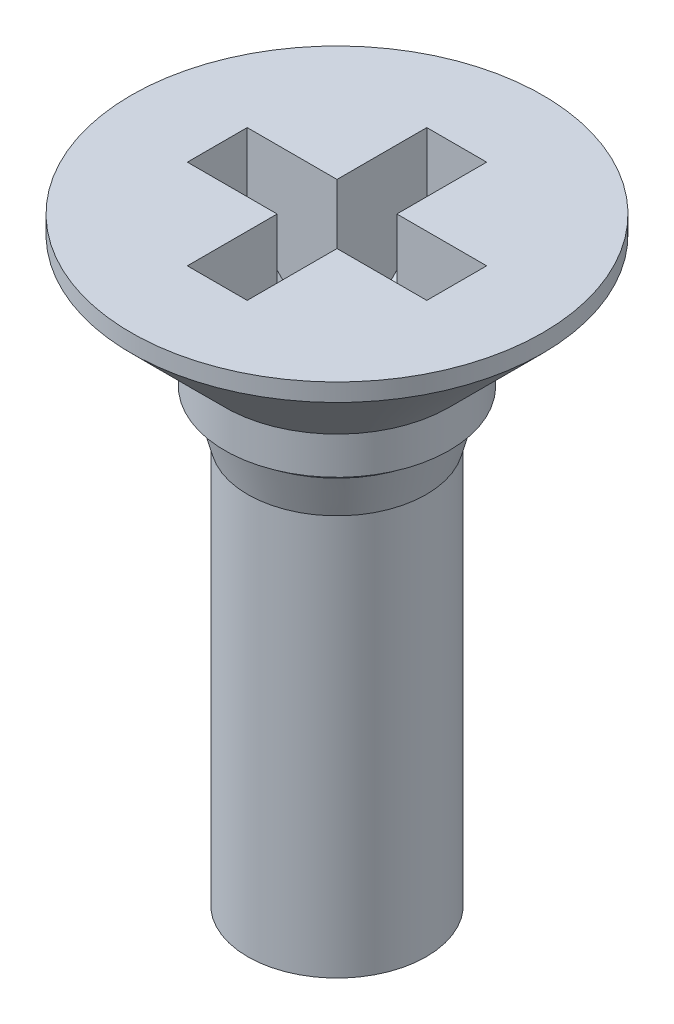
ISO-10303-21;
HEADER;
FILE_DESCRIPTION(('STEP AP214'),'2;1');
FILE_NAME('part.step','',(''),(''),'','','');
FILE_SCHEMA(('AUTOMOTIVE_DESIGN { 1 0 10303 214 1 1 1 1 }'));
ENDSEC;
DATA;
#1=APPLICATION_CONTEXT('core data for automotive mechanical design processes');
#2=APPLICATION_PROTOCOL_DEFINITION('international standard','automotive_design',2000,#1);
#3=PRODUCT_CONTEXT('',#1,'mechanical');
#4=PRODUCT('Part','Part','',(#3));
#5=PRODUCT_RELATED_PRODUCT_CATEGORY('part','',(#4));
#6=PRODUCT_DEFINITION_FORMATION('','',#4);
#7=PRODUCT_DEFINITION_CONTEXT('part definition',#1,'design');
#8=PRODUCT_DEFINITION('design','',#6,#7);
#9=PRODUCT_DEFINITION_SHAPE('','',#8);
#10=(LENGTH_UNIT() NAMED_UNIT(*) SI_UNIT(.MILLI.,.METRE.));
#11=(NAMED_UNIT(*) PLANE_ANGLE_UNIT() SI_UNIT($,.RADIAN.));
#12=(NAMED_UNIT(*) SI_UNIT($,.STERADIAN.) SOLID_ANGLE_UNIT());
#13=UNCERTAINTY_MEASURE_WITH_UNIT(LENGTH_MEASURE(1.E-05),#10,'distance_accuracy_value','');
#14=(GEOMETRIC_REPRESENTATION_CONTEXT(3) GLOBAL_UNCERTAINTY_ASSIGNED_CONTEXT((#13)) GLOBAL_UNIT_ASSIGNED_CONTEXT((#10,
#11,#12)) REPRESENTATION_CONTEXT('',''));
#15=CARTESIAN_POINT('',(0.,0.,0.));
#16=DIRECTION('',(0.,0.,1.));
#17=DIRECTION('',(1.,0.,0.));
#18=AXIS2_PLACEMENT_3D('',#15,#16,#17);
#19=CARTESIAN_POINT('',(0.,-2.65,-0.4));
#20=DIRECTION('',(0.,0.,-1.));
#21=DIRECTION('',(-1.,0.,0.));
#22=AXIS2_PLACEMENT_3D('',#19,#20,#21);
#23=PLANE('',#22);
#24=DIRECTION('',(0.,1.,0.));
#25=VECTOR('',#24,1.);
#26=CARTESIAN_POINT('',(0.4,-2.65,-0.4));
#27=LINE('',#26,#25);
#28=CARTESIAN_POINT('',(0.4,-2.1,-0.4));
#29=VERTEX_POINT('',#28);
#30=CARTESIAN_POINT('',(0.4,0.,-0.4));
#31=VERTEX_POINT('',#30);
#32=EDGE_CURVE('E198',#29,#31,#27,.T.);
#33=ORIENTED_EDGE('',*,*,#32,.F.);
#34=DIRECTION('',(1.,0.,0.));
#35=VECTOR('',#34,1.);
#36=CARTESIAN_POINT('',(-0.550000000000002,-2.1,-0.4));
#37=LINE('',#36,#35);
#38=CARTESIAN_POINT('',(0.550000000000002,-2.1,-0.4));
#39=VERTEX_POINT('',#38);
#40=EDGE_CURVE('E233',#29,#39,#37,.T.);
#41=ORIENTED_EDGE('',*,*,#40,.T.);
#42=DIRECTION('',(0.707106781186546,0.707106781186548,0.));
#43=VECTOR('',#42,1.);
#44=CARTESIAN_POINT('',(1.6,-1.05,-0.4));
#45=LINE('',#44,#43);
#46=CARTESIAN_POINT('',(1.6,-1.05,-0.4));
#47=VERTEX_POINT('',#46);
#48=EDGE_CURVE('E237',#39,#47,#45,.T.);
#49=ORIENTED_EDGE('',*,*,#48,.T.);
#50=DIRECTION('',(0.,1.,0.));
#51=VECTOR('',#50,1.);
#52=CARTESIAN_POINT('',(1.6,0.,-0.4));
#53=LINE('',#52,#51);
#54=CARTESIAN_POINT('',(1.6,0.,-0.4));
#55=VERTEX_POINT('',#54);
#56=EDGE_CURVE('E240',#47,#55,#53,.T.);
#57=ORIENTED_EDGE('',*,*,#56,.T.);
#58=DIRECTION('',(-1.,0.,0.));
#59=VECTOR('',#58,1.);
#60=CARTESIAN_POINT('',(1.6,0.,-0.4));
#61=LINE('',#60,#59);
#62=EDGE_CURVE('E244',#55,#31,#61,.T.);
#63=ORIENTED_EDGE('',*,*,#62,.T.);
#64=EDGE_LOOP('',(#33,#41,#49,#57,#63));
#65=FACE_BOUND('',#64,.T.);
#66=ADVANCED_FACE('F36',(#65),#23,.F.);
#67=CARTESIAN_POINT('',(0.,-2.65,0.4));
#68=DIRECTION('',(0.,0.,-1.));
#69=DIRECTION('',(-1.,0.,0.));
#70=AXIS2_PLACEMENT_3D('',#67,#68,#69);
#71=PLANE('',#70);
#72=DIRECTION('',(1.,0.,0.));
#73=VECTOR('',#72,1.);
#74=CARTESIAN_POINT('',(-0.550000000000002,-2.1,0.4));
#75=LINE('',#74,#73);
#76=CARTESIAN_POINT('',(0.4,-2.1,0.4));
#77=VERTEX_POINT('',#76);
#78=CARTESIAN_POINT('',(0.550000000000002,-2.1,0.4));
#79=VERTEX_POINT('',#78);
#80=EDGE_CURVE('E215',#77,#79,#75,.T.);
#81=ORIENTED_EDGE('',*,*,#80,.F.);
#82=DIRECTION('',(0.,1.,0.));
#83=VECTOR('',#82,1.);
#84=CARTESIAN_POINT('',(0.4,-2.65,0.4));
#85=LINE('',#84,#83);
#86=CARTESIAN_POINT('',(0.4,0.,0.4));
#87=VERTEX_POINT('',#86);
#88=EDGE_CURVE('E44',#77,#87,#85,.T.);
#89=ORIENTED_EDGE('',*,*,#88,.T.);
#90=DIRECTION('',(-1.,0.,0.));
#91=VECTOR('',#90,1.);
#92=CARTESIAN_POINT('',(1.6,0.,0.4));
#93=LINE('',#92,#91);
#94=CARTESIAN_POINT('',(1.6,0.,0.4));
#95=VERTEX_POINT('',#94);
#96=EDGE_CURVE('E224',#95,#87,#93,.T.);
#97=ORIENTED_EDGE('',*,*,#96,.F.);
#98=DIRECTION('',(0.,1.,0.));
#99=VECTOR('',#98,1.);
#100=CARTESIAN_POINT('',(1.6,0.,0.4));
#101=LINE('',#100,#99);
#102=CARTESIAN_POINT('',(1.6,-1.05,0.4));
#103=VERTEX_POINT('',#102);
#104=EDGE_CURVE('E221',#103,#95,#101,.T.);
#105=ORIENTED_EDGE('',*,*,#104,.F.);
#106=DIRECTION('',(0.707106781186546,0.707106781186548,0.));
#107=VECTOR('',#106,1.);
#108=CARTESIAN_POINT('',(1.6,-1.05,0.4));
#109=LINE('',#108,#107);
#110=EDGE_CURVE('E218',#79,#103,#109,.T.);
#111=ORIENTED_EDGE('',*,*,#110,.F.);
#112=EDGE_LOOP('',(#81,#89,#97,#105,#111));
#113=FACE_BOUND('',#112,.T.);
#114=ADVANCED_FACE('F290',(#113),#71,.T.);
#115=CARTESIAN_POINT('',(0.,0.,0.));
#116=DIRECTION('',(0.,-1.,0.));
#117=DIRECTION('',(1.,0.,0.));
#118=AXIS2_PLACEMENT_3D('',#115,#116,#117);
#119=PLANE('',#118);
#120=DIRECTION('',(1.,0.,0.));
#121=VECTOR('',#120,1.);
#122=CARTESIAN_POINT('',(-0.4,0.,1.6));
#123=LINE('',#122,#121);
#124=CARTESIAN_POINT('',(-0.4,0.,1.6));
#125=VERTEX_POINT('',#124);
#126=CARTESIAN_POINT('',(0.4,0.,1.6));
#127=VERTEX_POINT('',#126);
#128=EDGE_CURVE('E199',#125,#127,#123,.T.);
#129=ORIENTED_EDGE('',*,*,#128,.F.);
#130=DIRECTION('',(0.,0.,1.));
#131=VECTOR('',#130,1.);
#132=CARTESIAN_POINT('',(-0.4,0.,-1.6));
#133=LINE('',#132,#131);
#134=CARTESIAN_POINT('',(-0.4,0.,0.399999999999999));
#135=VERTEX_POINT('',#134);
#136=EDGE_CURVE('E192',#135,#125,#133,.T.);
#137=ORIENTED_EDGE('',*,*,#136,.F.);
#138=CARTESIAN_POINT('',(-1.6,0.,0.4));
#139=VERTEX_POINT('',#138);
#140=EDGE_CURVE('E223',#135,#139,#93,.T.);
#141=ORIENTED_EDGE('',*,*,#140,.T.);
#142=DIRECTION('',(0.,0.,1.));
#143=VECTOR('',#142,1.);
#144=CARTESIAN_POINT('',(-1.6,0.,-0.4));
#145=LINE('',#144,#143);
#146=CARTESIAN_POINT('',(-1.6,0.,-0.4));
#147=VERTEX_POINT('',#146);
#148=EDGE_CURVE('E254',#147,#139,#145,.T.);
#149=ORIENTED_EDGE('',*,*,#148,.F.);
#150=CARTESIAN_POINT('',(-0.4,0.,-0.4));
#151=VERTEX_POINT('',#150);
#152=EDGE_CURVE('E243',#151,#147,#61,.T.);
#153=ORIENTED_EDGE('',*,*,#152,.F.);
#154=CARTESIAN_POINT('',(-0.4,0.,-1.6));
#155=VERTEX_POINT('',#154);
#156=EDGE_CURVE('E193',#155,#151,#133,.T.);
#157=ORIENTED_EDGE('',*,*,#156,.F.);
#158=DIRECTION('',(1.,0.,0.));
#159=VECTOR('',#158,1.);
#160=CARTESIAN_POINT('',(-0.4,0.,-1.6));
#161=LINE('',#160,#159);
#162=CARTESIAN_POINT('',(0.4,0.,-1.6));
#163=VERTEX_POINT('',#162);
#164=EDGE_CURVE('E201',#155,#163,#161,.T.);
#165=ORIENTED_EDGE('',*,*,#164,.T.);
#166=DIRECTION('',(0.,0.,1.));
#167=VECTOR('',#166,1.);
#168=CARTESIAN_POINT('',(0.4,0.,-1.6));
#169=LINE('',#168,#167);
#170=EDGE_CURVE('E177',#163,#31,#169,.T.);
#171=ORIENTED_EDGE('',*,*,#170,.T.);
#172=ORIENTED_EDGE('',*,*,#62,.F.);
#173=DIRECTION('',(0.,0.,1.));
#174=VECTOR('',#173,1.);
#175=CARTESIAN_POINT('',(1.6,0.,-0.4));
#176=LINE('',#175,#174);
#177=EDGE_CURVE('E257',#55,#95,#176,.T.);
#178=ORIENTED_EDGE('',*,*,#177,.T.);
#179=ORIENTED_EDGE('',*,*,#96,.T.);
#180=EDGE_CURVE('E59',#87,#127,#169,.T.);
#181=ORIENTED_EDGE('',*,*,#180,.T.);
#182=EDGE_LOOP('',(#129,#137,#141,#149,#153,#157,#165,#171,#172,#178,#179,#181));
#183=FACE_BOUND('',#182,.T.);
#184=CARTESIAN_POINT('',(0.,0.,0.));
#185=DIRECTION('',(0.,1.,0.));
#186=DIRECTION('',(-1.,0.,0.));
#187=AXIS2_PLACEMENT_3D('',#184,#185,#186);
#188=CIRCLE('',#187,2.75);
#189=CARTESIAN_POINT('',(-2.75,0.,0.));
#190=VERTEX_POINT('',#189);
#191=EDGE_CURVE('E286',#190,#190,#188,.T.);
#192=ORIENTED_EDGE('',*,*,#191,.T.);
#193=EDGE_LOOP('',(#192));
#194=FACE_BOUND('',#193,.T.);
#195=ADVANCED_FACE('F38',(#183,#194),#119,.F.);
#196=CARTESIAN_POINT('',(0.,0.,0.));
#197=DIRECTION('',(0.,1.,0.));
#198=DIRECTION('',(-1.,0.,0.));
#199=AXIS2_PLACEMENT_3D('',#196,#197,#198);
#200=CYLINDRICAL_SURFACE('',#199,2.75);
#201=ORIENTED_EDGE('',*,*,#191,.F.);
#202=EDGE_LOOP('',(#201));
#203=FACE_BOUND('',#202,.T.);
#204=CARTESIAN_POINT('',(0.,-0.237500000000007,0.));
#205=DIRECTION('',(0.,1.,0.));
#206=DIRECTION('',(-1.,0.,0.));
#207=AXIS2_PLACEMENT_3D('',#204,#205,#206);
#208=CIRCLE('',#207,2.75);
#209=CARTESIAN_POINT('',(-2.75,-0.237500000000007,0.));
#210=VERTEX_POINT('',#209);
#211=EDGE_CURVE('E283',#210,#210,#208,.T.);
#212=ORIENTED_EDGE('',*,*,#211,.T.);
#213=EDGE_LOOP('',(#212));
#214=FACE_BOUND('',#213,.T.);
#215=ADVANCED_FACE('F399',(#203,#214),#200,.T.);
#216=CARTESIAN_POINT('',(0.,-1.4875,0.));
#217=DIRECTION('',(0.,1.,0.));
#218=DIRECTION('',(-1.,0.,0.));
#219=AXIS2_PLACEMENT_3D('',#216,#217,#218);
#220=CONICAL_SURFACE('',#219,1.5,0.78539816339745);
#221=ORIENTED_EDGE('',*,*,#211,.F.);
#222=EDGE_LOOP('',(#221));
#223=FACE_BOUND('',#222,.T.);
#224=CARTESIAN_POINT('',(0.,-1.4875,0.));
#225=DIRECTION('',(0.,1.,0.));
#226=DIRECTION('',(-1.,0.,0.));
#227=AXIS2_PLACEMENT_3D('',#224,#225,#226);
#228=CIRCLE('',#227,1.5);
#229=CARTESIAN_POINT('',(-1.5,-1.4875,0.));
#230=VERTEX_POINT('',#229);
#231=EDGE_CURVE('E280',#230,#230,#228,.T.);
#232=ORIENTED_EDGE('',*,*,#231,.T.);
#233=EDGE_LOOP('',(#232));
#234=FACE_BOUND('',#233,.T.);
#235=ADVANCED_FACE('F396',(#223,#234),#220,.T.);
#236=CARTESIAN_POINT('',(0.,0.,0.));
#237=DIRECTION('',(0.,1.,0.));
#238=DIRECTION('',(-1.,0.,0.));
#239=AXIS2_PLACEMENT_3D('',#236,#237,#238);
#240=CYLINDRICAL_SURFACE('',#239,1.5);
#241=ORIENTED_EDGE('',*,*,#231,.F.);
#242=EDGE_LOOP('',(#241));
#243=FACE_BOUND('',#242,.T.);
#244=CARTESIAN_POINT('',(0.,-1.9875,0.));
#245=DIRECTION('',(0.,1.,0.));
#246=DIRECTION('',(-1.,0.,0.));
#247=AXIS2_PLACEMENT_3D('',#244,#245,#246);
#248=CIRCLE('',#247,1.5);
#249=CARTESIAN_POINT('',(-1.5,-1.9875,0.));
#250=VERTEX_POINT('',#249);
#251=EDGE_CURVE('E277',#250,#250,#248,.T.);
#252=ORIENTED_EDGE('',*,*,#251,.T.);
#253=EDGE_LOOP('',(#252));
#254=FACE_BOUND('',#253,.T.);
#255=ADVANCED_FACE('F392',(#243,#254),#240,.T.);
#256=CARTESIAN_POINT('',(1.5,-1.9875,0.));
#257=DIRECTION('',(0.,1.,0.));
#258=DIRECTION('',(-1.,0.,0.));
#259=AXIS2_PLACEMENT_3D('',#256,#257,#258);
#260=PLANE('',#259);
#261=ORIENTED_EDGE('',*,*,#251,.F.);
#262=EDGE_LOOP('',(#261));
#263=FACE_BOUND('',#262,.T.);
#264=CARTESIAN_POINT('',(0.,-1.9875,0.));
#265=DIRECTION('',(0.,1.,0.));
#266=DIRECTION('',(-1.,0.,0.));
#267=AXIS2_PLACEMENT_3D('',#264,#265,#266);
#268=CIRCLE('',#267,1.3375);
#269=CARTESIAN_POINT('',(-1.3375,-1.9875,0.));
#270=VERTEX_POINT('',#269);
#271=EDGE_CURVE('E274',#270,#270,#268,.T.);
#272=ORIENTED_EDGE('',*,*,#271,.T.);
#273=EDGE_LOOP('',(#272));
#274=FACE_BOUND('',#273,.T.);
#275=ADVANCED_FACE('F388',(#263,#274),#260,.F.);
#276=CARTESIAN_POINT('',(0.,0.,0.));
#277=DIRECTION('',(0.,1.,0.));
#278=DIRECTION('',(-1.,0.,0.));
#279=AXIS2_PLACEMENT_3D('',#276,#277,#278);
#280=CYLINDRICAL_SURFACE('',#279,1.3375);
#281=ORIENTED_EDGE('',*,*,#271,.F.);
#282=EDGE_LOOP('',(#281));
#283=FACE_BOUND('',#282,.T.);
#284=CARTESIAN_POINT('',(0.,-2.11258468371008,0.));
#285=DIRECTION('',(0.,1.,0.));
#286=DIRECTION('',(-1.,0.,0.));
#287=AXIS2_PLACEMENT_3D('',#284,#285,#286);
#288=CIRCLE('',#287,1.3375);
#289=CARTESIAN_POINT('',(-1.3375,-2.11258468371008,0.));
#290=VERTEX_POINT('',#289);
#291=EDGE_CURVE('E271',#290,#290,#288,.T.);
#292=ORIENTED_EDGE('',*,*,#291,.T.);
#293=EDGE_LOOP('',(#292));
#294=FACE_BOUND('',#293,.T.);
#295=ADVANCED_FACE('F384',(#283,#294),#280,.T.);
#296=CARTESIAN_POINT('',(0.,-2.65,0.));
#297=DIRECTION('',(0.,1.,0.));
#298=DIRECTION('',(-1.,0.,0.));
#299=AXIS2_PLACEMENT_3D('',#296,#297,#298);
#300=CONICAL_SURFACE('',#299,1.1935,0.26179938779915);
#301=ORIENTED_EDGE('',*,*,#291,.F.);
#302=EDGE_LOOP('',(#301));
#303=FACE_BOUND('',#302,.T.);
#304=CARTESIAN_POINT('',(0.,-2.65,0.));
#305=DIRECTION('',(0.,1.,0.));
#306=DIRECTION('',(-1.,0.,0.));
#307=AXIS2_PLACEMENT_3D('',#304,#305,#306);
#308=CIRCLE('',#307,1.1935);
#309=CARTESIAN_POINT('',(-1.1935,-2.65,0.));
#310=VERTEX_POINT('',#309);
#311=EDGE_CURVE('E268',#310,#310,#308,.T.);
#312=ORIENTED_EDGE('',*,*,#311,.T.);
#313=EDGE_LOOP('',(#312));
#314=FACE_BOUND('',#313,.T.);
#315=ADVANCED_FACE('F380',(#303,#314),#300,.T.);
#316=CARTESIAN_POINT('',(0.,0.,0.));
#317=DIRECTION('',(0.,1.,0.));
#318=DIRECTION('',(-1.,0.,0.));
#319=AXIS2_PLACEMENT_3D('',#316,#317,#318);
#320=CYLINDRICAL_SURFACE('',#319,1.1935);
#321=ORIENTED_EDGE('',*,*,#311,.F.);
#322=EDGE_LOOP('',(#321));
#323=FACE_BOUND('',#322,.T.);
#324=CARTESIAN_POINT('',(0.,-8.,0.));
#325=DIRECTION('',(0.,1.,0.));
#326=DIRECTION('',(-1.,0.,0.));
#327=AXIS2_PLACEMENT_3D('',#324,#325,#326);
#328=CIRCLE('',#327,1.1935);
#329=CARTESIAN_POINT('',(-1.1935,-8.,0.));
#330=VERTEX_POINT('',#329);
#331=EDGE_CURVE('E253',#330,#330,#328,.T.);
#332=ORIENTED_EDGE('',*,*,#331,.T.);
#333=EDGE_LOOP('',(#332));
#334=FACE_BOUND('',#333,.T.);
#335=ADVANCED_FACE('F376',(#323,#334),#320,.T.);
#336=CARTESIAN_POINT('',(1.1935,-8.,0.));
#337=DIRECTION('',(0.,1.,0.));
#338=DIRECTION('',(-1.,0.,0.));
#339=AXIS2_PLACEMENT_3D('',#336,#337,#338);
#340=PLANE('',#339);
#341=ORIENTED_EDGE('',*,*,#331,.F.);
#342=EDGE_LOOP('',(#341));
#343=FACE_BOUND('',#342,.T.);
#344=ADVANCED_FACE('F373',(#343),#340,.F.);
#345=CARTESIAN_POINT('',(-1.6,-1.05,-0.4));
#346=DIRECTION('',(-0.707106781186548,-0.707106781186546,0.));
#347=DIRECTION('',(0.707106781186547,-0.707106781186548,0.));
#348=AXIS2_PLACEMENT_3D('',#345,#346,#347);
#349=PLANE('',#348);
#350=DIRECTION('',(0.,0.,1.));
#351=VECTOR('',#350,1.);
#352=CARTESIAN_POINT('',(-0.550000000000002,-2.1,-0.4));
#353=LINE('',#352,#351);
#354=CARTESIAN_POINT('',(-0.550000000000002,-2.1,-0.4));
#355=VERTEX_POINT('',#354);
#356=CARTESIAN_POINT('',(-0.550000000000002,-2.1,0.4));
#357=VERTEX_POINT('',#356);
#358=EDGE_CURVE('E250',#355,#357,#353,.T.);
#359=ORIENTED_EDGE('',*,*,#358,.F.);
#360=DIRECTION('',(0.707106781186546,-0.707106781186548,0.));
#361=VECTOR('',#360,1.);
#362=CARTESIAN_POINT('',(-1.6,-1.05,-0.4));
#363=LINE('',#362,#361);
#364=CARTESIAN_POINT('',(-1.6,-1.05,-0.4));
#365=VERTEX_POINT('',#364);
#366=EDGE_CURVE('E230',#365,#355,#363,.T.);
#367=ORIENTED_EDGE('',*,*,#366,.F.);
#368=DIRECTION('',(0.,0.,1.));
#369=VECTOR('',#368,1.);
#370=CARTESIAN_POINT('',(-1.6,-1.05,-0.4));
#371=LINE('',#370,#369);
#372=CARTESIAN_POINT('',(-1.6,-1.05,0.4));
#373=VERTEX_POINT('',#372);
#374=EDGE_CURVE('E251',#365,#373,#371,.T.);
#375=ORIENTED_EDGE('',*,*,#374,.T.);
#376=DIRECTION('',(0.707106781186546,-0.707106781186548,0.));
#377=VECTOR('',#376,1.);
#378=CARTESIAN_POINT('',(-1.6,-1.05,0.4));
#379=LINE('',#378,#377);
#380=EDGE_CURVE('E212',#373,#357,#379,.T.);
#381=ORIENTED_EDGE('',*,*,#380,.T.);
#382=EDGE_LOOP('',(#359,#367,#375,#381));
#383=FACE_BOUND('',#382,.T.);
#384=ADVANCED_FACE('F327',(#383),#349,.F.);
#385=CARTESIAN_POINT('',(-1.6,0.,-0.4));
#386=DIRECTION('',(-1.,0.,0.));
#387=DIRECTION('',(0.,0.,1.));
#388=AXIS2_PLACEMENT_3D('',#385,#386,#387);
#389=PLANE('',#388);
#390=ORIENTED_EDGE('',*,*,#374,.F.);
#391=DIRECTION('',(0.,-1.,0.));
#392=VECTOR('',#391,1.);
#393=CARTESIAN_POINT('',(-1.6,0.,-0.4));
#394=LINE('',#393,#392);
#395=EDGE_CURVE('E247',#147,#365,#394,.T.);
#396=ORIENTED_EDGE('',*,*,#395,.F.);
#397=ORIENTED_EDGE('',*,*,#148,.T.);
#398=DIRECTION('',(0.,-1.,0.));
#399=VECTOR('',#398,1.);
#400=CARTESIAN_POINT('',(-1.6,0.,0.4));
#401=LINE('',#400,#399);
#402=EDGE_CURVE('E227',#139,#373,#401,.T.);
#403=ORIENTED_EDGE('',*,*,#402,.T.);
#404=EDGE_LOOP('',(#390,#396,#397,#403));
#405=FACE_BOUND('',#404,.T.);
#406=ADVANCED_FACE('F372',(#405),#389,.F.);
#407=CARTESIAN_POINT('',(1.6,0.,-0.4));
#408=DIRECTION('',(1.,0.,0.));
#409=DIRECTION('',(0.,0.,-1.));
#410=AXIS2_PLACEMENT_3D('',#407,#408,#409);
#411=PLANE('',#410);
#412=ORIENTED_EDGE('',*,*,#177,.F.);
#413=ORIENTED_EDGE('',*,*,#56,.F.);
#414=DIRECTION('',(0.,0.,1.));
#415=VECTOR('',#414,1.);
#416=CARTESIAN_POINT('',(1.6,-1.05,-0.4));
#417=LINE('',#416,#415);
#418=EDGE_CURVE('E260',#47,#103,#417,.T.);
#419=ORIENTED_EDGE('',*,*,#418,.T.);
#420=ORIENTED_EDGE('',*,*,#104,.T.);
#421=EDGE_LOOP('',(#412,#413,#419,#420));
#422=FACE_BOUND('',#421,.T.);
#423=ADVANCED_FACE('F299',(#422),#411,.F.);
#424=CARTESIAN_POINT('',(1.6,-1.05,-0.4));
#425=DIRECTION('',(0.707106781186548,-0.707106781186546,0.));
#426=DIRECTION('',(0.707106781186547,0.707106781186548,0.));
#427=AXIS2_PLACEMENT_3D('',#424,#425,#426);
#428=PLANE('',#427);
#429=ORIENTED_EDGE('',*,*,#418,.F.);
#430=ORIENTED_EDGE('',*,*,#48,.F.);
#431=DIRECTION('',(0.,0.,1.));
#432=VECTOR('',#431,1.);
#433=CARTESIAN_POINT('',(0.550000000000002,-2.1,-0.4));
#434=LINE('',#433,#432);
#435=EDGE_CURVE('E262',#39,#79,#434,.T.);
#436=ORIENTED_EDGE('',*,*,#435,.T.);
#437=ORIENTED_EDGE('',*,*,#110,.T.);
#438=EDGE_LOOP('',(#429,#430,#436,#437));
#439=FACE_BOUND('',#438,.T.);
#440=ADVANCED_FACE('F305',(#439),#428,.F.);
#441=CARTESIAN_POINT('',(-0.550000000000002,-2.1,-0.4));
#442=DIRECTION('',(0.,-1.,0.));
#443=DIRECTION('',(0.,0.,-1.));
#444=AXIS2_PLACEMENT_3D('',#441,#442,#443);
#445=PLANE('',#444);
#446=CARTESIAN_POINT('',(-0.4,-2.1,0.4));
#447=VERTEX_POINT('',#446);
#448=EDGE_CURVE('E216',#357,#447,#75,.T.);
#449=ORIENTED_EDGE('',*,*,#448,.T.);
#450=DIRECTION('',(0.,0.,-1.));
#451=VECTOR('',#450,1.);
#452=CARTESIAN_POINT('',(-0.4,-2.1,0.550000000000002));
#453=LINE('',#452,#451);
#454=CARTESIAN_POINT('',(-0.4,-2.1,0.550000000000002));
#455=VERTEX_POINT('',#454);
#456=EDGE_CURVE('E155',#455,#447,#453,.T.);
#457=ORIENTED_EDGE('',*,*,#456,.F.);
#458=DIRECTION('',(1.,0.,0.));
#459=VECTOR('',#458,1.);
#460=CARTESIAN_POINT('',(-0.4,-2.1,0.550000000000002));
#461=LINE('',#460,#459);
#462=CARTESIAN_POINT('',(0.4,-2.1,0.550000000000002));
#463=VERTEX_POINT('',#462);
#464=EDGE_CURVE('E149',#455,#463,#461,.T.);
#465=ORIENTED_EDGE('',*,*,#464,.T.);
#466=DIRECTION('',(0.,0.,-1.));
#467=VECTOR('',#466,1.);
#468=CARTESIAN_POINT('',(0.4,-2.1,0.550000000000002));
#469=LINE('',#468,#467);
#470=EDGE_CURVE('E153',#463,#77,#469,.T.);
#471=ORIENTED_EDGE('',*,*,#470,.T.);
#472=ORIENTED_EDGE('',*,*,#80,.T.);
#473=ORIENTED_EDGE('',*,*,#435,.F.);
#474=ORIENTED_EDGE('',*,*,#40,.F.);
#475=CARTESIAN_POINT('',(0.4,-2.1,-0.550000000000002));
#476=VERTEX_POINT('',#475);
#477=EDGE_CURVE('E51',#29,#476,#469,.T.);
#478=ORIENTED_EDGE('',*,*,#477,.T.);
#479=DIRECTION('',(1.,0.,0.));
#480=VECTOR('',#479,1.);
#481=CARTESIAN_POINT('',(-0.4,-2.1,-0.550000000000002));
#482=LINE('',#481,#480);
#483=CARTESIAN_POINT('',(-0.4,-2.1,-0.550000000000002));
#484=VERTEX_POINT('',#483);
#485=EDGE_CURVE('E160',#484,#476,#482,.T.);
#486=ORIENTED_EDGE('',*,*,#485,.F.);
#487=CARTESIAN_POINT('',(-0.4,-2.1,-0.4));
#488=VERTEX_POINT('',#487);
#489=EDGE_CURVE('E184',#488,#484,#453,.T.);
#490=ORIENTED_EDGE('',*,*,#489,.F.);
#491=EDGE_CURVE('E234',#355,#488,#37,.T.);
#492=ORIENTED_EDGE('',*,*,#491,.F.);
#493=ORIENTED_EDGE('',*,*,#358,.T.);
#494=EDGE_LOOP('',(#449,#457,#465,#471,#472,#473,#474,#478,#486,#490,#492,#493));
#495=FACE_BOUND('',#494,.T.);
#496=ADVANCED_FACE('F152',(#495),#445,.F.);
#497=ORIENTED_EDGE('',*,*,#491,.T.);
#498=DIRECTION('',(0.,1.,0.));
#499=VECTOR('',#498,1.);
#500=CARTESIAN_POINT('',(-0.4,-2.65,-0.4));
#501=LINE('',#500,#499);
#502=EDGE_CURVE('E209',#488,#151,#501,.T.);
#503=ORIENTED_EDGE('',*,*,#502,.T.);
#504=ORIENTED_EDGE('',*,*,#152,.T.);
#505=ORIENTED_EDGE('',*,*,#395,.T.);
#506=ORIENTED_EDGE('',*,*,#366,.T.);
#507=EDGE_LOOP('',(#497,#503,#504,#505,#506));
#508=FACE_BOUND('',#507,.T.);
#509=ADVANCED_FACE('F322',(#508),#23,.F.);
#510=DIRECTION('',(0.,1.,0.));
#511=VECTOR('',#510,1.);
#512=CARTESIAN_POINT('',(-0.4,-2.65,0.4));
#513=LINE('',#512,#511);
#514=EDGE_CURVE('E11',#447,#135,#513,.T.);
#515=ORIENTED_EDGE('',*,*,#514,.F.);
#516=ORIENTED_EDGE('',*,*,#448,.F.);
#517=ORIENTED_EDGE('',*,*,#380,.F.);
#518=ORIENTED_EDGE('',*,*,#402,.F.);
#519=ORIENTED_EDGE('',*,*,#140,.F.);
#520=EDGE_LOOP('',(#515,#516,#517,#518,#519));
#521=FACE_BOUND('',#520,.T.);
#522=ADVANCED_FACE('F332',(#521),#71,.T.);
#523=CARTESIAN_POINT('',(-0.4,-1.05,1.6));
#524=DIRECTION('',(0.,-0.707106781186546,0.707106781186548));
#525=DIRECTION('',(0.,-0.707106781186548,-0.707106781186547));
#526=AXIS2_PLACEMENT_3D('',#523,#524,#525);
#527=PLANE('',#526);
#528=ORIENTED_EDGE('',*,*,#464,.F.);
#529=DIRECTION('',(0.,-0.707106781186548,-0.707106781186546));
#530=VECTOR('',#529,1.);
#531=CARTESIAN_POINT('',(-0.4,-1.05,1.6));
#532=LINE('',#531,#530);
#533=CARTESIAN_POINT('',(-0.4,-1.05,1.6));
#534=VERTEX_POINT('',#533);
#535=EDGE_CURVE('E182',#534,#455,#532,.T.);
#536=ORIENTED_EDGE('',*,*,#535,.F.);
#537=DIRECTION('',(1.,0.,0.));
#538=VECTOR('',#537,1.);
#539=CARTESIAN_POINT('',(-0.4,-1.05,1.6));
#540=LINE('',#539,#538);
#541=CARTESIAN_POINT('',(0.4,-1.05,1.6));
#542=VERTEX_POINT('',#541);
#543=EDGE_CURVE('E169',#534,#542,#540,.T.);
#544=ORIENTED_EDGE('',*,*,#543,.T.);
#545=DIRECTION('',(0.,-0.707106781186548,-0.707106781186546));
#546=VECTOR('',#545,1.);
#547=CARTESIAN_POINT('',(0.4,-1.05,1.6));
#548=LINE('',#547,#546);
#549=EDGE_CURVE('E165',#542,#463,#548,.T.);
#550=ORIENTED_EDGE('',*,*,#549,.T.);
#551=EDGE_LOOP('',(#528,#536,#544,#550));
#552=FACE_BOUND('',#551,.T.);
#553=ADVANCED_FACE('F168',(#552),#527,.F.);
#554=CARTESIAN_POINT('',(-0.4,-2.65,0.));
#555=DIRECTION('',(-1.,0.,0.));
#556=DIRECTION('',(0.,0.,1.));
#557=AXIS2_PLACEMENT_3D('',#554,#555,#556);
#558=PLANE('',#557);
#559=ORIENTED_EDGE('',*,*,#514,.T.);
#560=ORIENTED_EDGE('',*,*,#136,.T.);
#561=DIRECTION('',(0.,-1.,0.));
#562=VECTOR('',#561,1.);
#563=CARTESIAN_POINT('',(-0.4,0.,1.6));
#564=LINE('',#563,#562);
#565=EDGE_CURVE('E161',#125,#534,#564,.T.);
#566=ORIENTED_EDGE('',*,*,#565,.T.);
#567=ORIENTED_EDGE('',*,*,#535,.T.);
#568=ORIENTED_EDGE('',*,*,#456,.T.);
#569=EDGE_LOOP('',(#559,#560,#566,#567,#568));
#570=FACE_BOUND('',#569,.T.);
#571=ADVANCED_FACE('F337',(#570),#558,.F.);
#572=CARTESIAN_POINT('',(0.4,-2.65,0.));
#573=DIRECTION('',(-1.,0.,0.));
#574=DIRECTION('',(0.,0.,1.));
#575=AXIS2_PLACEMENT_3D('',#572,#573,#574);
#576=PLANE('',#575);
#577=ORIENTED_EDGE('',*,*,#470,.F.);
#578=ORIENTED_EDGE('',*,*,#549,.F.);
#579=DIRECTION('',(0.,-1.,0.));
#580=VECTOR('',#579,1.);
#581=CARTESIAN_POINT('',(0.4,0.,1.6));
#582=LINE('',#581,#580);
#583=EDGE_CURVE('E180',#127,#542,#582,.T.);
#584=ORIENTED_EDGE('',*,*,#583,.F.);
#585=ORIENTED_EDGE('',*,*,#180,.F.);
#586=ORIENTED_EDGE('',*,*,#88,.F.);
#587=EDGE_LOOP('',(#577,#578,#584,#585,#586));
#588=FACE_BOUND('',#587,.T.);
#589=ADVANCED_FACE('F164',(#588),#576,.T.);
#590=CARTESIAN_POINT('',(-0.4,0.,1.6));
#591=DIRECTION('',(0.,0.,1.));
#592=DIRECTION('',(1.,0.,0.));
#593=AXIS2_PLACEMENT_3D('',#590,#591,#592);
#594=PLANE('',#593);
#595=ORIENTED_EDGE('',*,*,#543,.F.);
#596=ORIENTED_EDGE('',*,*,#565,.F.);
#597=ORIENTED_EDGE('',*,*,#128,.T.);
#598=ORIENTED_EDGE('',*,*,#583,.T.);
#599=EDGE_LOOP('',(#595,#596,#597,#598));
#600=FACE_BOUND('',#599,.T.);
#601=ADVANCED_FACE('F341',(#600),#594,.F.);
#602=ORIENTED_EDGE('',*,*,#489,.T.);
#603=DIRECTION('',(0.,0.707106781186548,-0.707106781186546));
#604=VECTOR('',#603,1.);
#605=CARTESIAN_POINT('',(-0.4,-1.05,-1.6));
#606=LINE('',#605,#604);
#607=CARTESIAN_POINT('',(-0.4,-1.05,-1.6));
#608=VERTEX_POINT('',#607);
#609=EDGE_CURVE('E186',#484,#608,#606,.T.);
#610=ORIENTED_EDGE('',*,*,#609,.T.);
#611=DIRECTION('',(0.,1.,0.));
#612=VECTOR('',#611,1.);
#613=CARTESIAN_POINT('',(-0.4,0.,-1.6));
#614=LINE('',#613,#612);
#615=EDGE_CURVE('E189',#608,#155,#614,.T.);
#616=ORIENTED_EDGE('',*,*,#615,.T.);
#617=ORIENTED_EDGE('',*,*,#156,.T.);
#618=ORIENTED_EDGE('',*,*,#502,.F.);
#619=EDGE_LOOP('',(#602,#610,#616,#617,#618));
#620=FACE_BOUND('',#619,.T.);
#621=ADVANCED_FACE('F319',(#620),#558,.F.);
#622=ORIENTED_EDGE('',*,*,#32,.T.);
#623=ORIENTED_EDGE('',*,*,#170,.F.);
#624=DIRECTION('',(0.,1.,0.));
#625=VECTOR('',#624,1.);
#626=CARTESIAN_POINT('',(0.4,0.,-1.6));
#627=LINE('',#626,#625);
#628=CARTESIAN_POINT('',(0.4,-1.05,-1.6));
#629=VERTEX_POINT('',#628);
#630=EDGE_CURVE('E175',#629,#163,#627,.T.);
#631=ORIENTED_EDGE('',*,*,#630,.F.);
#632=DIRECTION('',(0.,0.707106781186548,-0.707106781186546));
#633=VECTOR('',#632,1.);
#634=CARTESIAN_POINT('',(0.4,-1.05,-1.6));
#635=LINE('',#634,#633);
#636=EDGE_CURVE('E166',#476,#629,#635,.T.);
#637=ORIENTED_EDGE('',*,*,#636,.F.);
#638=ORIENTED_EDGE('',*,*,#477,.F.);
#639=EDGE_LOOP('',(#622,#623,#631,#637,#638));
#640=FACE_BOUND('',#639,.T.);
#641=ADVANCED_FACE('F312',(#640),#576,.T.);
#642=CARTESIAN_POINT('',(-0.4,0.,-1.6));
#643=DIRECTION('',(0.,0.,-1.));
#644=DIRECTION('',(-1.,0.,0.));
#645=AXIS2_PLACEMENT_3D('',#642,#643,#644);
#646=PLANE('',#645);
#647=ORIENTED_EDGE('',*,*,#164,.F.);
#648=ORIENTED_EDGE('',*,*,#615,.F.);
#649=DIRECTION('',(1.,0.,0.));
#650=VECTOR('',#649,1.);
#651=CARTESIAN_POINT('',(-0.4,-1.05,-1.6));
#652=LINE('',#651,#650);
#653=EDGE_CURVE('E204',#608,#629,#652,.T.);
#654=ORIENTED_EDGE('',*,*,#653,.T.);
#655=ORIENTED_EDGE('',*,*,#630,.T.);
#656=EDGE_LOOP('',(#647,#648,#654,#655));
#657=FACE_BOUND('',#656,.T.);
#658=ADVANCED_FACE('F315',(#657),#646,.F.);
#659=CARTESIAN_POINT('',(-0.4,-1.05,-1.6));
#660=DIRECTION('',(0.,-0.707106781186546,-0.707106781186548));
#661=DIRECTION('',(0.,0.707106781186548,-0.707106781186547));
#662=AXIS2_PLACEMENT_3D('',#659,#660,#661);
#663=PLANE('',#662);
#664=ORIENTED_EDGE('',*,*,#653,.F.);
#665=ORIENTED_EDGE('',*,*,#609,.F.);
#666=ORIENTED_EDGE('',*,*,#485,.T.);
#667=ORIENTED_EDGE('',*,*,#636,.T.);
#668=EDGE_LOOP('',(#664,#665,#666,#667));
#669=FACE_BOUND('',#668,.T.);
#670=ADVANCED_FACE('F310',(#669),#663,.F.);
#671=CLOSED_SHELL('',(#66,#114,#195,#215,#235,#255,#275,#295,#315,#335,#344,#384,#406,#423,#440,
#496,#509,#522,#553,#571,#589,#601,#621,#641,#658,#670));
#672=MANIFOLD_SOLID_BREP('B2',#671);
#673=ADVANCED_BREP_SHAPE_REPRESENTATION('',(#18,#672),#14);
#674=SHAPE_DEFINITION_REPRESENTATION(#9,#673);
ENDSEC;
END-ISO-10303-21;
